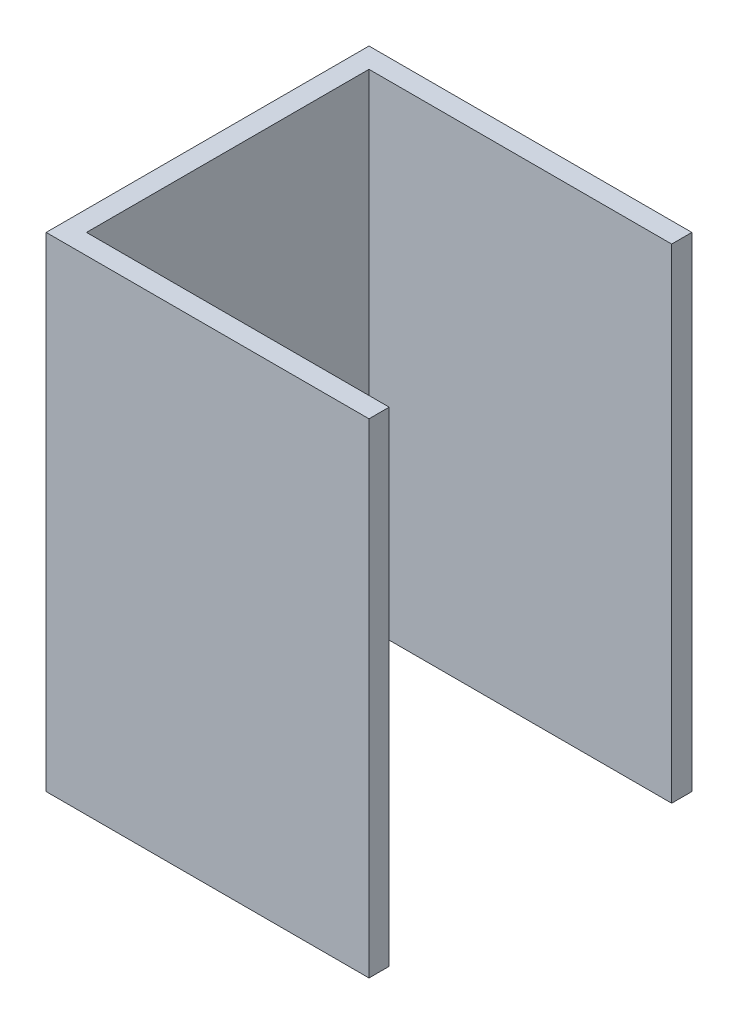
ISO-10303-21;
HEADER;
FILE_DESCRIPTION(('STEP AP214'),'2;1');
FILE_NAME('part.step','',(''),(''),'','','');
FILE_SCHEMA(('AUTOMOTIVE_DESIGN { 1 0 10303 214 1 1 1 1 }'));
ENDSEC;
DATA;
#1=APPLICATION_CONTEXT('core data for automotive mechanical design processes');
#2=APPLICATION_PROTOCOL_DEFINITION('international standard','automotive_design',2000,#1);
#3=PRODUCT_CONTEXT('',#1,'mechanical');
#4=PRODUCT('Part','Part','',(#3));
#5=PRODUCT_RELATED_PRODUCT_CATEGORY('part','',(#4));
#6=PRODUCT_DEFINITION_FORMATION('','',#4);
#7=PRODUCT_DEFINITION_CONTEXT('part definition',#1,'design');
#8=PRODUCT_DEFINITION('design','',#6,#7);
#9=PRODUCT_DEFINITION_SHAPE('','',#8);
#10=(LENGTH_UNIT() NAMED_UNIT(*) SI_UNIT(.MILLI.,.METRE.));
#11=(NAMED_UNIT(*) PLANE_ANGLE_UNIT() SI_UNIT($,.RADIAN.));
#12=(NAMED_UNIT(*) SI_UNIT($,.STERADIAN.) SOLID_ANGLE_UNIT());
#13=UNCERTAINTY_MEASURE_WITH_UNIT(LENGTH_MEASURE(1.E-05),#10,'distance_accuracy_value','');
#14=(GEOMETRIC_REPRESENTATION_CONTEXT(3) GLOBAL_UNCERTAINTY_ASSIGNED_CONTEXT((#13)) GLOBAL_UNIT_ASSIGNED_CONTEXT((#10,
#11,#12)) REPRESENTATION_CONTEXT('',''));
#15=CARTESIAN_POINT('',(0.,0.,0.));
#16=DIRECTION('',(0.,0.,1.));
#17=DIRECTION('',(1.,0.,0.));
#18=AXIS2_PLACEMENT_3D('',#15,#16,#17);
#19=CARTESIAN_POINT('',(0.,38.1,1.5875));
#20=DIRECTION('',(-1.,0.,0.));
#21=DIRECTION('',(0.,0.,1.));
#22=AXIS2_PLACEMENT_3D('',#19,#20,#21);
#23=PLANE('',#22);
#24=DIRECTION('',(0.,0.,-1.));
#25=VECTOR('',#24,1.);
#26=CARTESIAN_POINT('',(0.,0.,1.5875));
#27=LINE('',#26,#25);
#28=CARTESIAN_POINT('',(0.,0.,1.5875));
#29=VERTEX_POINT('',#28);
#30=CARTESIAN_POINT('',(0.,0.,0.));
#31=VERTEX_POINT('',#30);
#32=EDGE_CURVE('E131',#29,#31,#27,.T.);
#33=ORIENTED_EDGE('',*,*,#32,.T.);
#34=DIRECTION('',(0.,-1.,0.));
#35=VECTOR('',#34,1.);
#36=CARTESIAN_POINT('',(0.,38.1,0.));
#37=LINE('',#36,#35);
#38=CARTESIAN_POINT('',(0.,38.1,0.));
#39=VERTEX_POINT('',#38);
#40=EDGE_CURVE('E11',#39,#31,#37,.T.);
#41=ORIENTED_EDGE('',*,*,#40,.F.);
#42=DIRECTION('',(0.,0.,-1.));
#43=VECTOR('',#42,1.);
#44=CARTESIAN_POINT('',(0.,38.1,1.5875));
#45=LINE('',#44,#43);
#46=CARTESIAN_POINT('',(0.,38.1,1.5875));
#47=VERTEX_POINT('',#46);
#48=EDGE_CURVE('E145',#47,#39,#45,.T.);
#49=ORIENTED_EDGE('',*,*,#48,.F.);
#50=DIRECTION('',(0.,-1.,0.));
#51=VECTOR('',#50,1.);
#52=CARTESIAN_POINT('',(0.,38.1,1.5875));
#53=LINE('',#52,#51);
#54=EDGE_CURVE('E127',#47,#29,#53,.T.);
#55=ORIENTED_EDGE('',*,*,#54,.T.);
#56=EDGE_LOOP('',(#33,#41,#49,#55));
#57=FACE_BOUND('',#56,.T.);
#58=ADVANCED_FACE('F35',(#57),#23,.F.);
#59=CARTESIAN_POINT('',(0.,38.1,0.));
#60=DIRECTION('',(0.,0.,1.));
#61=DIRECTION('',(1.,0.,0.));
#62=AXIS2_PLACEMENT_3D('',#59,#60,#61);
#63=PLANE('',#62);
#64=DIRECTION('',(-1.,0.,0.));
#65=VECTOR('',#64,1.);
#66=CARTESIAN_POINT('',(0.,0.,0.));
#67=LINE('',#66,#65);
#68=CARTESIAN_POINT('',(-25.4,0.,0.));
#69=VERTEX_POINT('',#68);
#70=EDGE_CURVE('E134',#31,#69,#67,.T.);
#71=ORIENTED_EDGE('',*,*,#70,.T.);
#72=DIRECTION('',(0.,-1.,0.));
#73=VECTOR('',#72,1.);
#74=CARTESIAN_POINT('',(-25.4,38.1,0.));
#75=LINE('',#74,#73);
#76=CARTESIAN_POINT('',(-25.4,38.1,0.));
#77=VERTEX_POINT('',#76);
#78=EDGE_CURVE('E43',#77,#69,#75,.T.);
#79=ORIENTED_EDGE('',*,*,#78,.F.);
#80=DIRECTION('',(-1.,0.,0.));
#81=VECTOR('',#80,1.);
#82=CARTESIAN_POINT('',(0.,38.1,0.));
#83=LINE('',#82,#81);
#84=EDGE_CURVE('E94',#39,#77,#83,.T.);
#85=ORIENTED_EDGE('',*,*,#84,.F.);
#86=ORIENTED_EDGE('',*,*,#40,.T.);
#87=EDGE_LOOP('',(#71,#79,#85,#86));
#88=FACE_BOUND('',#87,.T.);
#89=ADVANCED_FACE('F180',(#88),#63,.F.);
#90=CARTESIAN_POINT('',(-25.4,38.1,0.));
#91=DIRECTION('',(1.,0.,0.));
#92=DIRECTION('',(0.,0.,-1.));
#93=AXIS2_PLACEMENT_3D('',#90,#91,#92);
#94=PLANE('',#93);
#95=DIRECTION('',(0.,0.,1.));
#96=VECTOR('',#95,1.);
#97=CARTESIAN_POINT('',(-25.4,0.,0.));
#98=LINE('',#97,#96);
#99=CARTESIAN_POINT('',(-25.4,0.,25.4));
#100=VERTEX_POINT('',#99);
#101=EDGE_CURVE('E136',#69,#100,#98,.T.);
#102=ORIENTED_EDGE('',*,*,#101,.T.);
#103=DIRECTION('',(0.,-1.,0.));
#104=VECTOR('',#103,1.);
#105=CARTESIAN_POINT('',(-25.4,38.1,25.4));
#106=LINE('',#105,#104);
#107=CARTESIAN_POINT('',(-25.4,38.1,25.4));
#108=VERTEX_POINT('',#107);
#109=EDGE_CURVE('E152',#108,#100,#106,.T.);
#110=ORIENTED_EDGE('',*,*,#109,.F.);
#111=DIRECTION('',(0.,0.,1.));
#112=VECTOR('',#111,1.);
#113=CARTESIAN_POINT('',(-25.4,38.1,0.));
#114=LINE('',#113,#112);
#115=EDGE_CURVE('E160',#77,#108,#114,.T.);
#116=ORIENTED_EDGE('',*,*,#115,.F.);
#117=ORIENTED_EDGE('',*,*,#78,.T.);
#118=EDGE_LOOP('',(#102,#110,#116,#117));
#119=FACE_BOUND('',#118,.T.);
#120=ADVANCED_FACE('F158',(#119),#94,.F.);
#121=CARTESIAN_POINT('',(-25.4,38.1,25.4));
#122=DIRECTION('',(0.,0.,-1.));
#123=DIRECTION('',(-1.,0.,0.));
#124=AXIS2_PLACEMENT_3D('',#121,#122,#123);
#125=PLANE('',#124);
#126=DIRECTION('',(1.,0.,0.));
#127=VECTOR('',#126,1.);
#128=CARTESIAN_POINT('',(-25.4,0.,25.4));
#129=LINE('',#128,#127);
#130=CARTESIAN_POINT('',(0.,0.,25.4));
#131=VERTEX_POINT('',#130);
#132=EDGE_CURVE('E138',#100,#131,#129,.T.);
#133=ORIENTED_EDGE('',*,*,#132,.T.);
#134=DIRECTION('',(0.,-1.,0.));
#135=VECTOR('',#134,1.);
#136=CARTESIAN_POINT('',(0.,38.1,25.4));
#137=LINE('',#136,#135);
#138=CARTESIAN_POINT('',(0.,38.1,25.4));
#139=VERTEX_POINT('',#138);
#140=EDGE_CURVE('E149',#139,#131,#137,.T.);
#141=ORIENTED_EDGE('',*,*,#140,.F.);
#142=DIRECTION('',(1.,0.,0.));
#143=VECTOR('',#142,1.);
#144=CARTESIAN_POINT('',(-25.4,38.1,25.4));
#145=LINE('',#144,#143);
#146=EDGE_CURVE('E172',#108,#139,#145,.T.);
#147=ORIENTED_EDGE('',*,*,#146,.F.);
#148=ORIENTED_EDGE('',*,*,#109,.T.);
#149=EDGE_LOOP('',(#133,#141,#147,#148));
#150=FACE_BOUND('',#149,.T.);
#151=ADVANCED_FACE('F168',(#150),#125,.F.);
#152=CARTESIAN_POINT('',(0.,38.1,25.4));
#153=DIRECTION('',(-1.,0.,0.));
#154=DIRECTION('',(0.,0.,1.));
#155=AXIS2_PLACEMENT_3D('',#152,#153,#154);
#156=PLANE('',#155);
#157=DIRECTION('',(0.,0.,-1.));
#158=VECTOR('',#157,1.);
#159=CARTESIAN_POINT('',(0.,0.,25.4));
#160=LINE('',#159,#158);
#161=CARTESIAN_POINT('',(0.,0.,23.8125));
#162=VERTEX_POINT('',#161);
#163=EDGE_CURVE('E140',#131,#162,#160,.T.);
#164=ORIENTED_EDGE('',*,*,#163,.T.);
#165=DIRECTION('',(0.,-1.,0.));
#166=VECTOR('',#165,1.);
#167=CARTESIAN_POINT('',(0.,38.1,23.8125));
#168=LINE('',#167,#166);
#169=CARTESIAN_POINT('',(0.,38.1,23.8125));
#170=VERTEX_POINT('',#169);
#171=EDGE_CURVE('E122',#170,#162,#168,.T.);
#172=ORIENTED_EDGE('',*,*,#171,.F.);
#173=DIRECTION('',(0.,0.,-1.));
#174=VECTOR('',#173,1.);
#175=CARTESIAN_POINT('',(0.,38.1,25.4));
#176=LINE('',#175,#174);
#177=EDGE_CURVE('E113',#139,#170,#176,.T.);
#178=ORIENTED_EDGE('',*,*,#177,.F.);
#179=ORIENTED_EDGE('',*,*,#140,.T.);
#180=EDGE_LOOP('',(#164,#172,#178,#179));
#181=FACE_BOUND('',#180,.T.);
#182=ADVANCED_FACE('F171',(#181),#156,.F.);
#183=CARTESIAN_POINT('',(0.,38.1,23.8125));
#184=DIRECTION('',(0.,0.,1.));
#185=DIRECTION('',(1.,0.,0.));
#186=AXIS2_PLACEMENT_3D('',#183,#184,#185);
#187=PLANE('',#186);
#188=DIRECTION('',(-1.,0.,0.));
#189=VECTOR('',#188,1.);
#190=CARTESIAN_POINT('',(0.,0.,23.8125));
#191=LINE('',#190,#189);
#192=CARTESIAN_POINT('',(-23.8125,0.,23.8125));
#193=VERTEX_POINT('',#192);
#194=EDGE_CURVE('E121',#162,#193,#191,.T.);
#195=ORIENTED_EDGE('',*,*,#194,.T.);
#196=DIRECTION('',(0.,-1.,0.));
#197=VECTOR('',#196,1.);
#198=CARTESIAN_POINT('',(-23.8125,38.1,23.8125));
#199=LINE('',#198,#197);
#200=CARTESIAN_POINT('',(-23.8125,38.1,23.8125));
#201=VERTEX_POINT('',#200);
#202=EDGE_CURVE('E118',#201,#193,#199,.T.);
#203=ORIENTED_EDGE('',*,*,#202,.F.);
#204=DIRECTION('',(-1.,0.,0.));
#205=VECTOR('',#204,1.);
#206=CARTESIAN_POINT('',(0.,38.1,23.8125));
#207=LINE('',#206,#205);
#208=EDGE_CURVE('E107',#170,#201,#207,.T.);
#209=ORIENTED_EDGE('',*,*,#208,.F.);
#210=ORIENTED_EDGE('',*,*,#171,.T.);
#211=EDGE_LOOP('',(#195,#203,#209,#210));
#212=FACE_BOUND('',#211,.T.);
#213=ADVANCED_FACE('F119',(#212),#187,.F.);
#214=CARTESIAN_POINT('',(-23.8125,38.1,23.8125));
#215=DIRECTION('',(-1.,0.,0.));
#216=DIRECTION('',(0.,0.,1.));
#217=AXIS2_PLACEMENT_3D('',#214,#215,#216);
#218=PLANE('',#217);
#219=DIRECTION('',(0.,0.,-1.));
#220=VECTOR('',#219,1.);
#221=CARTESIAN_POINT('',(-23.8125,0.,23.8125));
#222=LINE('',#221,#220);
#223=CARTESIAN_POINT('',(-23.8125,0.,1.5875));
#224=VERTEX_POINT('',#223);
#225=EDGE_CURVE('E80',#193,#224,#222,.T.);
#226=ORIENTED_EDGE('',*,*,#225,.T.);
#227=DIRECTION('',(0.,-1.,0.));
#228=VECTOR('',#227,1.);
#229=CARTESIAN_POINT('',(-23.8125,38.1,1.5875));
#230=LINE('',#229,#228);
#231=CARTESIAN_POINT('',(-23.8125,38.1,1.5875));
#232=VERTEX_POINT('',#231);
#233=EDGE_CURVE('E123',#232,#224,#230,.T.);
#234=ORIENTED_EDGE('',*,*,#233,.F.);
#235=DIRECTION('',(0.,0.,-1.));
#236=VECTOR('',#235,1.);
#237=CARTESIAN_POINT('',(-23.8125,38.1,23.8125));
#238=LINE('',#237,#236);
#239=EDGE_CURVE('E111',#201,#232,#238,.T.);
#240=ORIENTED_EDGE('',*,*,#239,.F.);
#241=ORIENTED_EDGE('',*,*,#202,.T.);
#242=EDGE_LOOP('',(#226,#234,#240,#241));
#243=FACE_BOUND('',#242,.T.);
#244=ADVANCED_FACE('F125',(#243),#218,.F.);
#245=CARTESIAN_POINT('',(-23.8125,38.1,1.5875));
#246=DIRECTION('',(0.,0.,-1.));
#247=DIRECTION('',(-1.,0.,0.));
#248=AXIS2_PLACEMENT_3D('',#245,#246,#247);
#249=PLANE('',#248);
#250=DIRECTION('',(1.,0.,0.));
#251=VECTOR('',#250,1.);
#252=CARTESIAN_POINT('',(-23.8125,0.,1.5875));
#253=LINE('',#252,#251);
#254=EDGE_CURVE('E86',#224,#29,#253,.T.);
#255=ORIENTED_EDGE('',*,*,#254,.T.);
#256=ORIENTED_EDGE('',*,*,#54,.F.);
#257=DIRECTION('',(1.,0.,0.));
#258=VECTOR('',#257,1.);
#259=CARTESIAN_POINT('',(-23.8125,38.1,1.5875));
#260=LINE('',#259,#258);
#261=EDGE_CURVE('E51',#232,#47,#260,.T.);
#262=ORIENTED_EDGE('',*,*,#261,.F.);
#263=ORIENTED_EDGE('',*,*,#233,.T.);
#264=EDGE_LOOP('',(#255,#256,#262,#263));
#265=FACE_BOUND('',#264,.T.);
#266=ADVANCED_FACE('F196',(#265),#249,.F.);
#267=CARTESIAN_POINT('',(0.,38.1,0.));
#268=DIRECTION('',(0.,1.,0.));
#269=DIRECTION('',(0.,0.,1.));
#270=AXIS2_PLACEMENT_3D('',#267,#268,#269);
#271=PLANE('',#270);
#272=ORIENTED_EDGE('',*,*,#48,.T.);
#273=ORIENTED_EDGE('',*,*,#84,.T.);
#274=ORIENTED_EDGE('',*,*,#115,.T.);
#275=ORIENTED_EDGE('',*,*,#146,.T.);
#276=ORIENTED_EDGE('',*,*,#177,.T.);
#277=ORIENTED_EDGE('',*,*,#208,.T.);
#278=ORIENTED_EDGE('',*,*,#239,.T.);
#279=ORIENTED_EDGE('',*,*,#261,.T.);
#280=EDGE_LOOP('',(#272,#273,#274,#275,#276,#277,#278,#279));
#281=FACE_BOUND('',#280,.T.);
#282=ADVANCED_FACE('F109',(#281),#271,.T.);
#283=CARTESIAN_POINT('',(0.,0.,0.));
#284=DIRECTION('',(0.,1.,0.));
#285=DIRECTION('',(0.,0.,1.));
#286=AXIS2_PLACEMENT_3D('',#283,#284,#285);
#287=PLANE('',#286);
#288=ORIENTED_EDGE('',*,*,#32,.F.);
#289=ORIENTED_EDGE('',*,*,#254,.F.);
#290=ORIENTED_EDGE('',*,*,#225,.F.);
#291=ORIENTED_EDGE('',*,*,#194,.F.);
#292=ORIENTED_EDGE('',*,*,#163,.F.);
#293=ORIENTED_EDGE('',*,*,#132,.F.);
#294=ORIENTED_EDGE('',*,*,#101,.F.);
#295=ORIENTED_EDGE('',*,*,#70,.F.);
#296=EDGE_LOOP('',(#288,#289,#290,#291,#292,#293,#294,#295));
#297=FACE_BOUND('',#296,.T.);
#298=ADVANCED_FACE('F164',(#297),#287,.F.);
#299=CLOSED_SHELL('',(#58,#89,#120,#151,#182,#213,#244,#266,#282,#298));
#300=MANIFOLD_SOLID_BREP('B2',#299);
#301=ADVANCED_BREP_SHAPE_REPRESENTATION('',(#18,#300),#14);
#302=SHAPE_DEFINITION_REPRESENTATION(#9,#301);
ENDSEC;
END-ISO-10303-21;
